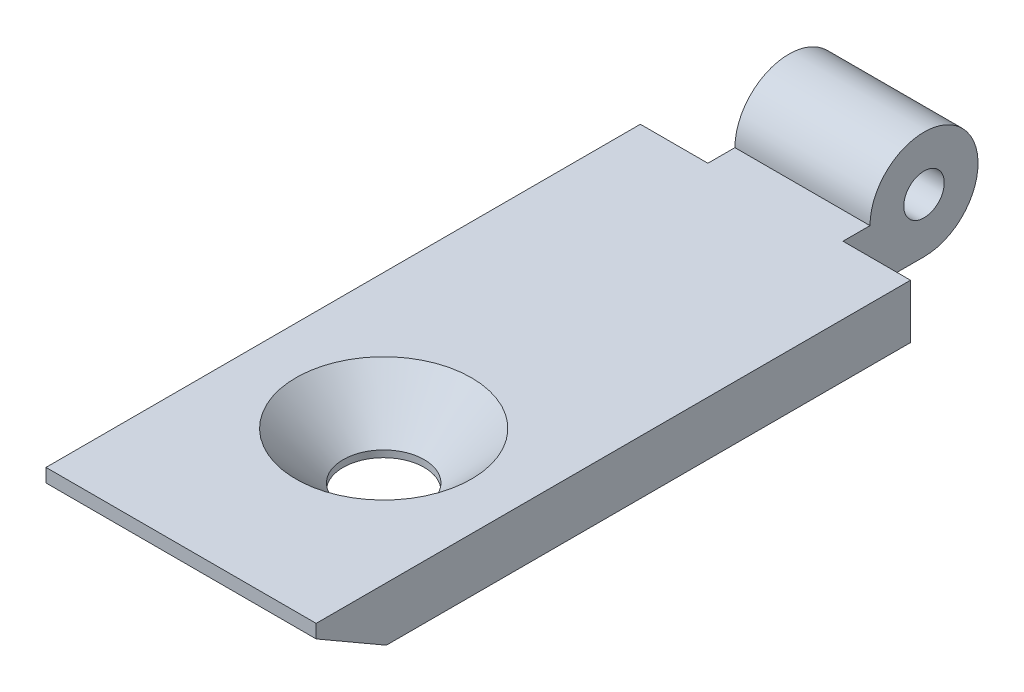
ISO-10303-21;
HEADER;
FILE_DESCRIPTION(('STEP AP214'),'2;1');
FILE_NAME('part.step','',(''),(''),'','','');
FILE_SCHEMA(('AUTOMOTIVE_DESIGN { 1 0 10303 214 1 1 1 1 }'));
ENDSEC;
DATA;
#1=APPLICATION_CONTEXT('core data for automotive mechanical design processes');
#2=APPLICATION_PROTOCOL_DEFINITION('international standard','automotive_design',2000,#1);
#3=PRODUCT_CONTEXT('',#1,'mechanical');
#4=PRODUCT('Part','Part','',(#3));
#5=PRODUCT_RELATED_PRODUCT_CATEGORY('part','',(#4));
#6=PRODUCT_DEFINITION_FORMATION('','',#4);
#7=PRODUCT_DEFINITION_CONTEXT('part definition',#1,'design');
#8=PRODUCT_DEFINITION('design','',#6,#7);
#9=PRODUCT_DEFINITION_SHAPE('','',#8);
#10=(LENGTH_UNIT() NAMED_UNIT(*) SI_UNIT(.MILLI.,.METRE.));
#11=(NAMED_UNIT(*) PLANE_ANGLE_UNIT() SI_UNIT($,.RADIAN.));
#12=(NAMED_UNIT(*) SI_UNIT($,.STERADIAN.) SOLID_ANGLE_UNIT());
#13=UNCERTAINTY_MEASURE_WITH_UNIT(LENGTH_MEASURE(1.E-05),#10,'distance_accuracy_value','');
#14=(GEOMETRIC_REPRESENTATION_CONTEXT(3) GLOBAL_UNCERTAINTY_ASSIGNED_CONTEXT((#13)) GLOBAL_UNIT_ASSIGNED_CONTEXT((#10,
#11,#12)) REPRESENTATION_CONTEXT('',''));
#15=CARTESIAN_POINT('',(0.,0.,0.));
#16=DIRECTION('',(0.,0.,1.));
#17=DIRECTION('',(1.,0.,0.));
#18=AXIS2_PLACEMENT_3D('',#15,#16,#17);
#19=CARTESIAN_POINT('',(10.,0.,0.));
#20=DIRECTION('',(1.,0.,0.));
#21=DIRECTION('',(0.,0.,-1.));
#22=AXIS2_PLACEMENT_3D('',#19,#20,#21);
#23=PLANE('',#22);
#24=DIRECTION('',(0.,1.,0.));
#25=VECTOR('',#24,1.);
#26=CARTESIAN_POINT('',(10.,-4.00000000000001,6.));
#27=LINE('',#26,#25);
#28=CARTESIAN_POINT('',(10.,-4.00000000000001,6.));
#29=VERTEX_POINT('',#28);
#30=CARTESIAN_POINT('',(10.,0.,6.));
#31=VERTEX_POINT('',#30);
#32=EDGE_CURVE('E108',#29,#31,#27,.T.);
#33=ORIENTED_EDGE('',*,*,#32,.T.);
#34=DIRECTION('',(0.,0.,1.));
#35=VECTOR('',#34,1.);
#36=CARTESIAN_POINT('',(10.,0.,50.));
#37=LINE('',#36,#35);
#38=CARTESIAN_POINT('',(10.,0.,50.));
#39=VERTEX_POINT('',#38);
#40=EDGE_CURVE('E148',#31,#39,#37,.T.);
#41=ORIENTED_EDGE('',*,*,#40,.T.);
#42=DIRECTION('',(0.,-1.,0.));
#43=VECTOR('',#42,1.);
#44=CARTESIAN_POINT('',(10.,-1.,50.));
#45=LINE('',#44,#43);
#46=CARTESIAN_POINT('',(10.,-1.,50.));
#47=VERTEX_POINT('',#46);
#48=EDGE_CURVE('E136',#39,#47,#45,.T.);
#49=ORIENTED_EDGE('',*,*,#48,.T.);
#50=DIRECTION('',(0.,-0.500000000000001,-0.866025403784438));
#51=VECTOR('',#50,1.);
#52=CARTESIAN_POINT('',(10.,-4.00000000000001,44.8038475772934));
#53=LINE('',#52,#51);
#54=CARTESIAN_POINT('',(10.,-4.00000000000001,44.8038475772934));
#55=VERTEX_POINT('',#54);
#56=EDGE_CURVE('E129',#47,#55,#53,.T.);
#57=ORIENTED_EDGE('',*,*,#56,.T.);
#58=DIRECTION('',(0.,0.,-1.));
#59=VECTOR('',#58,1.);
#60=CARTESIAN_POINT('',(10.,-4.,0.));
#61=LINE('',#60,#59);
#62=EDGE_CURVE('E123',#55,#29,#61,.T.);
#63=ORIENTED_EDGE('',*,*,#62,.T.);
#64=EDGE_LOOP('',(#33,#41,#49,#57,#63));
#65=FACE_BOUND('',#64,.T.);
#66=ADVANCED_FACE('F36',(#65),#23,.T.);
#67=CARTESIAN_POINT('',(-10.,0.,0.));
#68=DIRECTION('',(1.,0.,0.));
#69=DIRECTION('',(0.,0.,-1.));
#70=AXIS2_PLACEMENT_3D('',#67,#68,#69);
#71=PLANE('',#70);
#72=DIRECTION('',(0.,0.,1.));
#73=VECTOR('',#72,1.);
#74=CARTESIAN_POINT('',(-10.,0.,50.));
#75=LINE('',#74,#73);
#76=CARTESIAN_POINT('',(-10.,0.,6.));
#77=VERTEX_POINT('',#76);
#78=CARTESIAN_POINT('',(-10.,0.,50.));
#79=VERTEX_POINT('',#78);
#80=EDGE_CURVE('E140',#77,#79,#75,.T.);
#81=ORIENTED_EDGE('',*,*,#80,.F.);
#82=DIRECTION('',(0.,1.,0.));
#83=VECTOR('',#82,1.);
#84=CARTESIAN_POINT('',(-10.,-4.00000000000001,6.));
#85=LINE('',#84,#83);
#86=CARTESIAN_POINT('',(-10.,-4.00000000000001,6.));
#87=VERTEX_POINT('',#86);
#88=EDGE_CURVE('E236',#87,#77,#85,.T.);
#89=ORIENTED_EDGE('',*,*,#88,.F.);
#90=DIRECTION('',(0.,0.,-1.));
#91=VECTOR('',#90,1.);
#92=CARTESIAN_POINT('',(-10.,-4.,0.));
#93=LINE('',#92,#91);
#94=CARTESIAN_POINT('',(-10.,-4.00000000000001,44.8038475772934));
#95=VERTEX_POINT('',#94);
#96=EDGE_CURVE('E146',#95,#87,#93,.T.);
#97=ORIENTED_EDGE('',*,*,#96,.F.);
#98=DIRECTION('',(0.,-0.500000000000001,-0.866025403784438));
#99=VECTOR('',#98,1.);
#100=CARTESIAN_POINT('',(-10.,-4.00000000000001,44.8038475772934));
#101=LINE('',#100,#99);
#102=CARTESIAN_POINT('',(-10.,-1.,50.));
#103=VERTEX_POINT('',#102);
#104=EDGE_CURVE('E144',#103,#95,#101,.T.);
#105=ORIENTED_EDGE('',*,*,#104,.F.);
#106=DIRECTION('',(0.,-1.,0.));
#107=VECTOR('',#106,1.);
#108=CARTESIAN_POINT('',(-10.,-1.,50.));
#109=LINE('',#108,#107);
#110=EDGE_CURVE('E142',#79,#103,#109,.T.);
#111=ORIENTED_EDGE('',*,*,#110,.F.);
#112=EDGE_LOOP('',(#81,#89,#97,#105,#111));
#113=FACE_BOUND('',#112,.T.);
#114=ADVANCED_FACE('F185',(#113),#71,.F.);
#115=CARTESIAN_POINT('',(10.,0.,0.));
#116=DIRECTION('',(-1.,0.,0.));
#117=DIRECTION('',(0.,0.,1.));
#118=AXIS2_PLACEMENT_3D('',#115,#116,#117);
#119=CYLINDRICAL_SURFACE('',#118,4.);
#120=DIRECTION('',(-1.,0.,0.));
#121=VECTOR('',#120,1.);
#122=CARTESIAN_POINT('',(10.,0.,4.));
#123=LINE('',#122,#121);
#124=CARTESIAN_POINT('',(5.,0.,4.));
#125=VERTEX_POINT('',#124);
#126=CARTESIAN_POINT('',(-5.,0.,4.));
#127=VERTEX_POINT('',#126);
#128=EDGE_CURVE('E157',#125,#127,#123,.T.);
#129=ORIENTED_EDGE('',*,*,#128,.F.);
#130=CARTESIAN_POINT('',(5.,0.,0.));
#131=DIRECTION('',(-1.,0.,0.));
#132=DIRECTION('',(0.,0.,1.));
#133=AXIS2_PLACEMENT_3D('',#130,#131,#132);
#134=CIRCLE('',#133,4.);
#135=CARTESIAN_POINT('',(5.,-4.00000000000001,0.));
#136=VERTEX_POINT('',#135);
#137=EDGE_CURVE('E213',#125,#136,#134,.T.);
#138=ORIENTED_EDGE('',*,*,#137,.T.);
#139=DIRECTION('',(-1.,0.,0.));
#140=VECTOR('',#139,1.);
#141=CARTESIAN_POINT('',(10.,-4.,0.));
#142=LINE('',#141,#140);
#143=CARTESIAN_POINT('',(-5.,-4.00000000000001,0.));
#144=VERTEX_POINT('',#143);
#145=EDGE_CURVE('E131',#136,#144,#142,.T.);
#146=ORIENTED_EDGE('',*,*,#145,.T.);
#147=CARTESIAN_POINT('',(-5.,0.,0.));
#148=DIRECTION('',(1.,0.,0.));
#149=DIRECTION('',(0.,0.,-1.));
#150=AXIS2_PLACEMENT_3D('',#147,#148,#149);
#151=CIRCLE('',#150,4.);
#152=EDGE_CURVE('E167',#144,#127,#151,.T.);
#153=ORIENTED_EDGE('',*,*,#152,.T.);
#154=EDGE_LOOP('',(#129,#138,#146,#153));
#155=FACE_BOUND('',#154,.T.);
#156=ADVANCED_FACE('F190',(#155),#119,.T.);
#157=CARTESIAN_POINT('',(10.,0.,50.));
#158=DIRECTION('',(0.,-1.,0.));
#159=DIRECTION('',(0.,0.,-1.));
#160=AXIS2_PLACEMENT_3D('',#157,#158,#159);
#161=PLANE('',#160);
#162=CARTESIAN_POINT('',(0.,0.,35.));
#163=DIRECTION('',(0.,-1.,0.));
#164=DIRECTION('',(0.,0.,-1.));
#165=AXIS2_PLACEMENT_3D('',#162,#163,#164);
#166=CIRCLE('',#165,6.50000000000001);
#167=CARTESIAN_POINT('',(0.,0.,28.5));
#168=VERTEX_POINT('',#167);
#169=EDGE_CURVE('E45',#168,#168,#166,.T.);
#170=ORIENTED_EDGE('',*,*,#169,.T.);
#171=EDGE_LOOP('',(#170));
#172=FACE_BOUND('',#171,.T.);
#173=ORIENTED_EDGE('',*,*,#40,.F.);
#174=DIRECTION('',(-1.,0.,0.));
#175=VECTOR('',#174,1.);
#176=CARTESIAN_POINT('',(10.,0.,6.));
#177=LINE('',#176,#175);
#178=CARTESIAN_POINT('',(5.,0.,6.));
#179=VERTEX_POINT('',#178);
#180=EDGE_CURVE('E111',#31,#179,#177,.T.);
#181=ORIENTED_EDGE('',*,*,#180,.T.);
#182=DIRECTION('',(0.,0.,-1.));
#183=VECTOR('',#182,1.);
#184=CARTESIAN_POINT('',(5.,0.,50.));
#185=LINE('',#184,#183);
#186=EDGE_CURVE('E166',#179,#125,#185,.T.);
#187=ORIENTED_EDGE('',*,*,#186,.T.);
#188=ORIENTED_EDGE('',*,*,#128,.T.);
#189=DIRECTION('',(0.,0.,1.));
#190=VECTOR('',#189,1.);
#191=CARTESIAN_POINT('',(-5.,0.,50.));
#192=LINE('',#191,#190);
#193=CARTESIAN_POINT('',(-5.,0.,6.));
#194=VERTEX_POINT('',#193);
#195=EDGE_CURVE('E163',#127,#194,#192,.T.);
#196=ORIENTED_EDGE('',*,*,#195,.T.);
#197=DIRECTION('',(-1.,0.,0.));
#198=VECTOR('',#197,1.);
#199=CARTESIAN_POINT('',(10.,0.,6.));
#200=LINE('',#199,#198);
#201=EDGE_CURVE('E220',#194,#77,#200,.T.);
#202=ORIENTED_EDGE('',*,*,#201,.T.);
#203=ORIENTED_EDGE('',*,*,#80,.T.);
#204=DIRECTION('',(-1.,0.,0.));
#205=VECTOR('',#204,1.);
#206=CARTESIAN_POINT('',(10.,0.,50.));
#207=LINE('',#206,#205);
#208=EDGE_CURVE('E154',#39,#79,#207,.T.);
#209=ORIENTED_EDGE('',*,*,#208,.F.);
#210=EDGE_LOOP('',(#173,#181,#187,#188,#196,#202,#203,#209));
#211=FACE_BOUND('',#210,.T.);
#212=ADVANCED_FACE('F171',(#172,#211),#161,.F.);
#213=CARTESIAN_POINT('',(10.,-1.,50.));
#214=DIRECTION('',(0.,0.,-1.));
#215=DIRECTION('',(-1.,0.,0.));
#216=AXIS2_PLACEMENT_3D('',#213,#214,#215);
#217=PLANE('',#216);
#218=ORIENTED_EDGE('',*,*,#110,.T.);
#219=DIRECTION('',(-1.,0.,0.));
#220=VECTOR('',#219,1.);
#221=CARTESIAN_POINT('',(10.,-1.,50.));
#222=LINE('',#221,#220);
#223=EDGE_CURVE('E151',#47,#103,#222,.T.);
#224=ORIENTED_EDGE('',*,*,#223,.F.);
#225=ORIENTED_EDGE('',*,*,#48,.F.);
#226=ORIENTED_EDGE('',*,*,#208,.T.);
#227=EDGE_LOOP('',(#218,#224,#225,#226));
#228=FACE_BOUND('',#227,.T.);
#229=ADVANCED_FACE('F202',(#228),#217,.F.);
#230=CARTESIAN_POINT('',(10.,-4.00000000000001,44.8038475772934));
#231=DIRECTION('',(0.,0.866025403784438,-0.500000000000001));
#232=DIRECTION('',(0.,0.500000000000001,0.866025403784438));
#233=AXIS2_PLACEMENT_3D('',#230,#231,#232);
#234=PLANE('',#233);
#235=ORIENTED_EDGE('',*,*,#104,.T.);
#236=DIRECTION('',(-1.,0.,0.));
#237=VECTOR('',#236,1.);
#238=CARTESIAN_POINT('',(10.,-4.00000000000001,44.8038475772934));
#239=LINE('',#238,#237);
#240=EDGE_CURVE('E134',#55,#95,#239,.T.);
#241=ORIENTED_EDGE('',*,*,#240,.F.);
#242=ORIENTED_EDGE('',*,*,#56,.F.);
#243=ORIENTED_EDGE('',*,*,#223,.T.);
#244=EDGE_LOOP('',(#235,#241,#242,#243));
#245=FACE_BOUND('',#244,.T.);
#246=ADVANCED_FACE('F198',(#245),#234,.F.);
#247=CARTESIAN_POINT('',(10.,-4.,0.));
#248=DIRECTION('',(0.,1.,0.));
#249=DIRECTION('',(0.,0.,1.));
#250=AXIS2_PLACEMENT_3D('',#247,#248,#249);
#251=PLANE('',#250);
#252=CARTESIAN_POINT('',(0.,-4.00000000000001,35.));
#253=DIRECTION('',(0.,1.,0.));
#254=DIRECTION('',(0.,0.,1.));
#255=AXIS2_PLACEMENT_3D('',#252,#253,#254);
#256=CIRCLE('',#255,3.);
#257=CARTESIAN_POINT('',(0.,-4.00000000000001,38.));
#258=VERTEX_POINT('',#257);
#259=EDGE_CURVE('E115',#258,#258,#256,.T.);
#260=ORIENTED_EDGE('',*,*,#259,.T.);
#261=EDGE_LOOP('',(#260));
#262=FACE_BOUND('',#261,.T.);
#263=DIRECTION('',(0.,0.,1.));
#264=VECTOR('',#263,1.);
#265=CARTESIAN_POINT('',(5.,-4.00000000000001,-4.));
#266=LINE('',#265,#264);
#267=CARTESIAN_POINT('',(5.,-4.,6.));
#268=VERTEX_POINT('',#267);
#269=EDGE_CURVE('E126',#136,#268,#266,.T.);
#270=ORIENTED_EDGE('',*,*,#269,.T.);
#271=DIRECTION('',(1.,0.,0.));
#272=VECTOR('',#271,1.);
#273=CARTESIAN_POINT('',(10.,-4.00000000000001,6.));
#274=LINE('',#273,#272);
#275=EDGE_CURVE('E52',#268,#29,#274,.T.);
#276=ORIENTED_EDGE('',*,*,#275,.T.);
#277=ORIENTED_EDGE('',*,*,#62,.F.);
#278=ORIENTED_EDGE('',*,*,#240,.T.);
#279=ORIENTED_EDGE('',*,*,#96,.T.);
#280=DIRECTION('',(1.,0.,0.));
#281=VECTOR('',#280,1.);
#282=CARTESIAN_POINT('',(-10.,-4.00000000000001,6.));
#283=LINE('',#282,#281);
#284=CARTESIAN_POINT('',(-5.,-4.,6.));
#285=VERTEX_POINT('',#284);
#286=EDGE_CURVE('E241',#87,#285,#283,.T.);
#287=ORIENTED_EDGE('',*,*,#286,.T.);
#288=DIRECTION('',(0.,0.,-1.));
#289=VECTOR('',#288,1.);
#290=CARTESIAN_POINT('',(-5.,-4.00000000000001,-4.));
#291=LINE('',#290,#289);
#292=EDGE_CURVE('E60',#285,#144,#291,.T.);
#293=ORIENTED_EDGE('',*,*,#292,.T.);
#294=ORIENTED_EDGE('',*,*,#145,.F.);
#295=EDGE_LOOP('',(#270,#276,#277,#278,#279,#287,#293,#294));
#296=FACE_BOUND('',#295,.T.);
#297=ADVANCED_FACE('F121',(#262,#296),#251,.F.);
#298=CARTESIAN_POINT('',(-10.,-4.00000000000001,6.));
#299=DIRECTION('',(0.,0.,1.));
#300=DIRECTION('',(1.,0.,0.));
#301=AXIS2_PLACEMENT_3D('',#298,#299,#300);
#302=PLANE('',#301);
#303=DIRECTION('',(0.,1.,0.));
#304=VECTOR('',#303,1.);
#305=CARTESIAN_POINT('',(-5.,-4.00000000000001,6.));
#306=LINE('',#305,#304);
#307=EDGE_CURVE('E238',#285,#194,#306,.T.);
#308=ORIENTED_EDGE('',*,*,#307,.F.);
#309=ORIENTED_EDGE('',*,*,#286,.F.);
#310=ORIENTED_EDGE('',*,*,#88,.T.);
#311=ORIENTED_EDGE('',*,*,#201,.F.);
#312=EDGE_LOOP('',(#308,#309,#310,#311));
#313=FACE_BOUND('',#312,.T.);
#314=ADVANCED_FACE('F197',(#313),#302,.F.);
#315=CARTESIAN_POINT('',(-5.,-4.00000000000001,-4.));
#316=DIRECTION('',(1.,0.,0.));
#317=DIRECTION('',(0.,0.,-1.));
#318=AXIS2_PLACEMENT_3D('',#315,#316,#317);
#319=PLANE('',#318);
#320=CARTESIAN_POINT('',(-5.,0.,0.));
#321=DIRECTION('',(1.,0.,0.));
#322=DIRECTION('',(0.,0.,-1.));
#323=AXIS2_PLACEMENT_3D('',#320,#321,#322);
#324=CIRCLE('',#323,1.5);
#325=CARTESIAN_POINT('',(-5.,0.,-1.5));
#326=VERTEX_POINT('',#325);
#327=EDGE_CURVE('E160',#326,#326,#324,.T.);
#328=ORIENTED_EDGE('',*,*,#327,.T.);
#329=EDGE_LOOP('',(#328));
#330=FACE_BOUND('',#329,.T.);
#331=ORIENTED_EDGE('',*,*,#292,.F.);
#332=ORIENTED_EDGE('',*,*,#307,.T.);
#333=ORIENTED_EDGE('',*,*,#195,.F.);
#334=ORIENTED_EDGE('',*,*,#152,.F.);
#335=EDGE_LOOP('',(#331,#332,#333,#334));
#336=FACE_BOUND('',#335,.T.);
#337=ADVANCED_FACE('F261',(#330,#336),#319,.F.);
#338=CARTESIAN_POINT('',(10.,-4.00000000000001,6.));
#339=DIRECTION('',(0.,0.,1.));
#340=DIRECTION('',(1.,0.,0.));
#341=AXIS2_PLACEMENT_3D('',#338,#339,#340);
#342=PLANE('',#341);
#343=ORIENTED_EDGE('',*,*,#32,.F.);
#344=ORIENTED_EDGE('',*,*,#275,.F.);
#345=DIRECTION('',(0.,1.,0.));
#346=VECTOR('',#345,1.);
#347=CARTESIAN_POINT('',(5.,-4.00000000000001,6.));
#348=LINE('',#347,#346);
#349=EDGE_CURVE('E116',#268,#179,#348,.T.);
#350=ORIENTED_EDGE('',*,*,#349,.T.);
#351=ORIENTED_EDGE('',*,*,#180,.F.);
#352=EDGE_LOOP('',(#343,#344,#350,#351));
#353=FACE_BOUND('',#352,.T.);
#354=ADVANCED_FACE('F109',(#353),#342,.F.);
#355=CARTESIAN_POINT('',(5.,-4.00000000000001,-4.));
#356=DIRECTION('',(-1.,0.,0.));
#357=DIRECTION('',(0.,0.,1.));
#358=AXIS2_PLACEMENT_3D('',#355,#356,#357);
#359=PLANE('',#358);
#360=CARTESIAN_POINT('',(5.,0.,0.));
#361=DIRECTION('',(-1.,0.,0.));
#362=DIRECTION('',(0.,0.,1.));
#363=AXIS2_PLACEMENT_3D('',#360,#361,#362);
#364=CIRCLE('',#363,1.5);
#365=CARTESIAN_POINT('',(5.,0.,1.5));
#366=VERTEX_POINT('',#365);
#367=EDGE_CURVE('E164',#366,#366,#364,.T.);
#368=ORIENTED_EDGE('',*,*,#367,.T.);
#369=EDGE_LOOP('',(#368));
#370=FACE_BOUND('',#369,.T.);
#371=ORIENTED_EDGE('',*,*,#137,.F.);
#372=ORIENTED_EDGE('',*,*,#186,.F.);
#373=ORIENTED_EDGE('',*,*,#349,.F.);
#374=ORIENTED_EDGE('',*,*,#269,.F.);
#375=EDGE_LOOP('',(#371,#372,#373,#374));
#376=FACE_BOUND('',#375,.T.);
#377=ADVANCED_FACE('F251',(#370,#376),#359,.F.);
#378=CARTESIAN_POINT('',(0.,-4.00000000000001,35.));
#379=DIRECTION('',(0.,1.,0.));
#380=DIRECTION('',(0.,0.,1.));
#381=AXIS2_PLACEMENT_3D('',#378,#379,#380);
#382=CYLINDRICAL_SURFACE('',#381,3.);
#383=CARTESIAN_POINT('',(0.,-3.50000000000003,35.));
#384=DIRECTION('',(0.,-1.,0.));
#385=DIRECTION('',(0.,0.,-1.));
#386=AXIS2_PLACEMENT_3D('',#383,#384,#385);
#387=CIRCLE('',#386,3.);
#388=CARTESIAN_POINT('',(0.,-3.50000000000003,32.));
#389=VERTEX_POINT('',#388);
#390=EDGE_CURVE('E11',#389,#389,#387,.F.);
#391=ORIENTED_EDGE('',*,*,#390,.T.);
#392=EDGE_LOOP('',(#391));
#393=FACE_BOUND('',#392,.T.);
#394=ORIENTED_EDGE('',*,*,#259,.F.);
#395=EDGE_LOOP('',(#394));
#396=FACE_BOUND('',#395,.T.);
#397=ADVANCED_FACE('F180',(#393,#396),#382,.F.);
#398=CARTESIAN_POINT('',(10.,0.,0.));
#399=DIRECTION('',(-1.,0.,0.));
#400=DIRECTION('',(0.,0.,1.));
#401=AXIS2_PLACEMENT_3D('',#398,#399,#400);
#402=CYLINDRICAL_SURFACE('',#401,1.5);
#403=ORIENTED_EDGE('',*,*,#367,.F.);
#404=EDGE_LOOP('',(#403));
#405=FACE_BOUND('',#404,.T.);
#406=ORIENTED_EDGE('',*,*,#327,.F.);
#407=EDGE_LOOP('',(#406));
#408=FACE_BOUND('',#407,.T.);
#409=ADVANCED_FACE('F175',(#405,#408),#402,.F.);
#410=CARTESIAN_POINT('',(0.,0.,35.));
#411=DIRECTION('',(0.,1.,0.));
#412=DIRECTION('',(0.,0.,1.));
#413=AXIS2_PLACEMENT_3D('',#410,#411,#412);
#414=CONICAL_SURFACE('',#413,6.50000000000001,0.785398163397445);
#415=ORIENTED_EDGE('',*,*,#390,.F.);
#416=EDGE_LOOP('',(#415));
#417=FACE_BOUND('',#416,.T.);
#418=ORIENTED_EDGE('',*,*,#169,.F.);
#419=EDGE_LOOP('',(#418));
#420=FACE_BOUND('',#419,.T.);
#421=ADVANCED_FACE('F39',(#417,#420),#414,.F.);
#422=CLOSED_SHELL('',(#66,#114,#156,#212,#229,#246,#297,#314,#337,#354,#377,#397,#409,#421));
#423=MANIFOLD_SOLID_BREP('B2',#422);
#424=ADVANCED_BREP_SHAPE_REPRESENTATION('',(#18,#423),#14);
#425=SHAPE_DEFINITION_REPRESENTATION(#9,#424);
ENDSEC;
END-ISO-10303-21;
